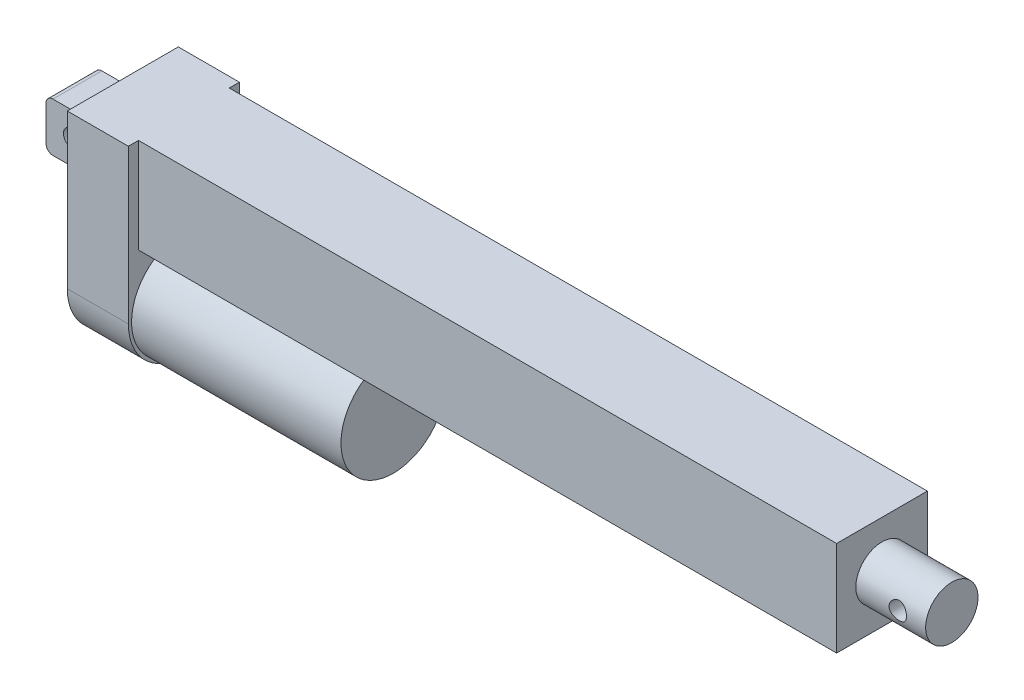
ISO-10303-21;
HEADER;
FILE_DESCRIPTION(('STEP AP214'),'2;1');
FILE_NAME('part.step','',(''),(''),'','','');
FILE_SCHEMA(('AUTOMOTIVE_DESIGN { 1 0 10303 214 1 1 1 1 }'));
ENDSEC;
DATA;
#1=APPLICATION_CONTEXT('core data for automotive mechanical design processes');
#2=APPLICATION_PROTOCOL_DEFINITION('international standard','automotive_design',2000,#1);
#3=PRODUCT_CONTEXT('',#1,'mechanical');
#4=PRODUCT('Part','Part','',(#3));
#5=PRODUCT_RELATED_PRODUCT_CATEGORY('part','',(#4));
#6=PRODUCT_DEFINITION_FORMATION('','',#4);
#7=PRODUCT_DEFINITION_CONTEXT('part definition',#1,'design');
#8=PRODUCT_DEFINITION('design','',#6,#7);
#9=PRODUCT_DEFINITION_SHAPE('','',#8);
#10=(LENGTH_UNIT() NAMED_UNIT(*) SI_UNIT(.MILLI.,.METRE.));
#11=(NAMED_UNIT(*) PLANE_ANGLE_UNIT() SI_UNIT($,.RADIAN.));
#12=(NAMED_UNIT(*) SI_UNIT($,.STERADIAN.) SOLID_ANGLE_UNIT());
#13=UNCERTAINTY_MEASURE_WITH_UNIT(LENGTH_MEASURE(1.E-05),#10,'distance_accuracy_value','');
#14=(GEOMETRIC_REPRESENTATION_CONTEXT(3) GLOBAL_UNCERTAINTY_ASSIGNED_CONTEXT((#13)) GLOBAL_UNIT_ASSIGNED_CONTEXT((#10,
#11,#12)) REPRESENTATION_CONTEXT('',''));
#15=CARTESIAN_POINT('',(0.,0.,0.));
#16=DIRECTION('',(0.,0.,1.));
#17=DIRECTION('',(1.,0.,0.));
#18=AXIS2_PLACEMENT_3D('',#15,#16,#17);
#19=CARTESIAN_POINT('',(-276.225,-38.735,0.));
#20=DIRECTION('',(-1.,0.,0.));
#21=DIRECTION('',(0.,0.,1.));
#22=AXIS2_PLACEMENT_3D('',#19,#20,#21);
#23=PLANE('',#22);
#24=DIRECTION('',(0.,1.,0.));
#25=VECTOR('',#24,1.);
#26=CARTESIAN_POINT('',(-276.225,-10.668,11.43));
#27=LINE('',#26,#25);
#28=CARTESIAN_POINT('',(-276.225,9.65199999999999,11.43));
#29=VERTEX_POINT('',#28);
#30=CARTESIAN_POINT('',(-276.225,-13.208,11.43));
#31=VERTEX_POINT('',#30);
#32=EDGE_CURVE('E395',#29,#31,#27,.F.);
#33=ORIENTED_EDGE('',*,*,#32,.T.);
#34=DIRECTION('',(0.,0.,-1.));
#35=VECTOR('',#34,1.);
#36=CARTESIAN_POINT('',(-276.225,-13.208,0.));
#37=LINE('',#36,#35);
#38=CARTESIAN_POINT('',(-276.225,-13.208,-11.43));
#39=VERTEX_POINT('',#38);
#40=EDGE_CURVE('E421',#31,#39,#37,.T.);
#41=ORIENTED_EDGE('',*,*,#40,.T.);
#42=DIRECTION('',(0.,1.,0.));
#43=VECTOR('',#42,1.);
#44=CARTESIAN_POINT('',(-276.225,-38.735,-11.43));
#45=LINE('',#44,#43);
#46=CARTESIAN_POINT('',(-276.225,9.65199999999999,-11.43));
#47=VERTEX_POINT('',#46);
#48=EDGE_CURVE('E424',#39,#47,#45,.T.);
#49=ORIENTED_EDGE('',*,*,#48,.T.);
#50=DIRECTION('',(0.,0.,-1.));
#51=VECTOR('',#50,1.);
#52=CARTESIAN_POINT('',(-276.225,9.65199999999999,0.));
#53=LINE('',#52,#51);
#54=EDGE_CURVE('E427',#47,#29,#53,.F.);
#55=ORIENTED_EDGE('',*,*,#54,.T.);
#56=EDGE_LOOP('',(#33,#41,#49,#55));
#57=FACE_BOUND('',#56,.T.);
#58=DIRECTION('',(0.,-1.,0.));
#59=VECTOR('',#58,1.);
#60=CARTESIAN_POINT('',(-276.225,17.272,-20.193));
#61=LINE('',#60,#59);
#62=CARTESIAN_POINT('',(-276.225,17.272,-20.193));
#63=VERTEX_POINT('',#62);
#64=CARTESIAN_POINT('',(-276.225,-38.735,-20.193));
#65=VERTEX_POINT('',#64);
#66=EDGE_CURVE('E165',#63,#65,#61,.T.);
#67=ORIENTED_EDGE('',*,*,#66,.T.);
#68=CARTESIAN_POINT('',(-276.225,-38.735,0.));
#69=DIRECTION('',(-1.,0.,0.));
#70=DIRECTION('',(0.,0.,1.));
#71=AXIS2_PLACEMENT_3D('',#68,#69,#70);
#72=CIRCLE('',#71,20.193);
#73=CARTESIAN_POINT('',(-276.225,-38.735,20.193));
#74=VERTEX_POINT('',#73);
#75=EDGE_CURVE('E154',#65,#74,#72,.T.);
#76=ORIENTED_EDGE('',*,*,#75,.T.);
#77=DIRECTION('',(0.,1.,0.));
#78=VECTOR('',#77,1.);
#79=CARTESIAN_POINT('',(-276.225,17.272,20.193));
#80=LINE('',#79,#78);
#81=CARTESIAN_POINT('',(-276.225,17.272,20.193));
#82=VERTEX_POINT('',#81);
#83=EDGE_CURVE('E164',#74,#82,#80,.T.);
#84=ORIENTED_EDGE('',*,*,#83,.T.);
#85=DIRECTION('',(0.,0.,-1.));
#86=VECTOR('',#85,1.);
#87=CARTESIAN_POINT('',(-276.225,17.272,-20.193));
#88=LINE('',#87,#86);
#89=EDGE_CURVE('E169',#82,#63,#88,.T.);
#90=ORIENTED_EDGE('',*,*,#89,.T.);
#91=EDGE_LOOP('',(#67,#76,#84,#90));
#92=FACE_BOUND('',#91,.T.);
#93=ADVANCED_FACE('F39',(#57,#92),#23,.T.);
#94=CARTESIAN_POINT('',(25.4,0.,0.));
#95=DIRECTION('',(-1.,0.,0.));
#96=DIRECTION('',(0.,0.,1.));
#97=AXIS2_PLACEMENT_3D('',#94,#95,#96);
#98=CYLINDRICAL_SURFACE('',#97,9.525);
#99=CARTESIAN_POINT('',(18.415,0.,-9.525));
#100=CARTESIAN_POINT('',(18.4150008055979,0.173238677165345,-9.52500048580498));
#101=CARTESIAN_POINT('',(18.4007751550461,0.346472492659894,-9.52023018186455));
#102=CARTESIAN_POINT('',(18.3444225795053,0.687837590771684,-9.50167042395416));
#103=CARTESIAN_POINT('',(18.3022927579622,0.855968341777242,-9.48788003366834));
#104=CARTESIAN_POINT('',(18.1917364022556,1.18215660666813,-9.45277852602955));
#105=CARTESIAN_POINT('',(18.1233538266918,1.34023044718815,-9.43147998545459));
#106=CARTESIAN_POINT('',(17.9624317762382,1.6426654243569,-9.3835361515256));
#107=CARTESIAN_POINT('',(17.8698875361167,1.78702384834388,-9.35688980370195));
#108=CARTESIAN_POINT('',(17.6599030695734,2.06292981819569,-9.30002249856541));
#109=CARTESIAN_POINT('',(17.5417758312229,2.19393674844712,-9.26971591772517));
#110=CARTESIAN_POINT('',(17.2854392838066,2.4346937993291,-9.20941499436411));
#111=CARTESIAN_POINT('',(17.147225564102,2.54443923892903,-9.17942072197494));
#112=CARTESIAN_POINT('',(16.8497722592512,2.74264419157344,-9.12219830615344));
#113=CARTESIAN_POINT('',(16.6900423763505,2.83040092485176,-9.0950744970031));
#114=CARTESIAN_POINT('',(16.3570409000941,2.97757492456175,-9.04796594704059));
#115=CARTESIAN_POINT('',(16.1837734580083,3.03700083920296,-9.02797902810368));
#116=CARTESIAN_POINT('',(15.8347625217479,3.12379824029158,-8.99830887880273));
#117=CARTESIAN_POINT('',(15.6592993630472,3.15218269826285,-8.98830104068516));
#118=CARTESIAN_POINT('',(15.3058375805551,3.17925806658695,-8.97876209798687));
#119=CARTESIAN_POINT('',(15.1278397572483,3.17795815259496,-8.97922775597168));
#120=CARTESIAN_POINT('',(14.7830011983402,3.14648819425834,-8.99029872650973));
#121=CARTESIAN_POINT('',(14.6160223207321,3.11764017430519,-9.00043970379418));
#122=CARTESIAN_POINT('',(14.2894258927483,3.03404956704688,-9.0289588827545));
#123=CARTESIAN_POINT('',(14.1298092262437,2.97930387942917,-9.04733807064542));
#124=CARTESIAN_POINT('',(13.8194645200471,2.84460650934115,-9.09059367841715));
#125=CARTESIAN_POINT('',(13.6689210191343,2.76426310464554,-9.11556996393148));
#126=CARTESIAN_POINT('',(13.3830348662119,2.58092291251245,-9.16916373477932));
#127=CARTESIAN_POINT('',(13.2476966219865,2.4779195817557,-9.19778227084722));
#128=CARTESIAN_POINT('',(12.9886341758396,2.24583413126609,-9.25726270107578));
#129=CARTESIAN_POINT('',(12.8658851949337,2.11567125149228,-9.28816371201626));
#130=CARTESIAN_POINT('',(12.6437032283437,1.83622813465494,-9.34742029378842));
#131=CARTESIAN_POINT('',(12.5442724788277,1.68694606622307,-9.37577562033364));
#132=CARTESIAN_POINT('',(12.3707642467537,1.37143367142189,-9.42711817702495));
#133=CARTESIAN_POINT('',(12.2969480649932,1.20504990262186,-9.45004936275525));
#134=CARTESIAN_POINT('',(12.1786549226906,0.861279339682304,-9.48755300683581));
#135=CARTESIAN_POINT('',(12.1341677705306,0.683896391141972,-9.50212836854242));
#136=CARTESIAN_POINT('',(12.077523260379,0.331418658755536,-9.52079715951823));
#137=CARTESIAN_POINT('',(12.0640481058765,0.156557979570884,-9.52531755822087));
#138=CARTESIAN_POINT('',(12.0660562386752,-0.192960847123755,-9.52464766056077));
#139=CARTESIAN_POINT('',(12.0815346379361,-0.36761902383989,-9.51945900331475));
#140=CARTESIAN_POINT('',(12.1399678070617,-0.70650057551601,-9.50023578476806));
#141=CARTESIAN_POINT('',(12.1821137042072,-0.870879661700627,-9.48646180908036));
#142=CARTESIAN_POINT('',(12.2916741861819,-1.19016766849014,-9.45171613685472));
#143=CARTESIAN_POINT('',(12.3590919933102,-1.34507537851482,-9.43074352248193));
#144=CARTESIAN_POINT('',(12.5192486210945,-1.64556534104864,-9.38304356837145));
#145=CARTESIAN_POINT('',(12.6126068336741,-1.79079512051443,-9.35617936849621));
#146=CARTESIAN_POINT('',(12.8212664262928,-2.06395583568048,-9.29974181184133));
#147=CARTESIAN_POINT('',(12.9365745079009,-2.19188146775095,-9.27016762910403));
#148=CARTESIAN_POINT('',(13.1920575344459,-2.43285171228499,-9.20993992337912));
#149=CARTESIAN_POINT('',(13.3331242954928,-2.54495607735531,-9.17929841452584));
#150=CARTESIAN_POINT('',(13.6327247277996,-2.74401763337734,-9.121774152107));
#151=CARTESIAN_POINT('',(13.7912585446632,-2.83097461468095,-9.09489142987858));
#152=CARTESIAN_POINT('',(14.1213618235454,-2.97687025407193,-9.04819093937643));
#153=CARTESIAN_POINT('',(14.2929041013608,-3.03586556962393,-9.02835890517708));
#154=CARTESIAN_POINT('',(14.6443022138901,-3.12386556696094,-8.99829392572978));
#155=CARTESIAN_POINT('',(14.8241542651588,-3.15288375947874,-8.98805665630056));
#156=CARTESIAN_POINT('',(15.1771257799299,-3.17905219686554,-8.97883201925513));
#157=CARTESIAN_POINT('',(15.3501164304107,-3.17776306695415,-8.97929370817294));
#158=CARTESIAN_POINT('',(15.6932791128776,-3.14719428169958,-8.9900528169078));
#159=CARTESIAN_POINT('',(15.8634513120074,-3.11791629228099,-9.00034965132724));
#160=CARTESIAN_POINT('',(16.1929307300329,-3.03330550668565,-9.02920864668032));
#161=CARTESIAN_POINT('',(16.3523829193893,-2.97847812359924,-9.04761011221367));
#162=CARTESIAN_POINT('',(16.659947017029,-2.84473448628718,-9.09054566248638));
#163=CARTESIAN_POINT('',(16.8080563990219,-2.76581288515832,-9.11508110823774));
#164=CARTESIAN_POINT('',(17.0957356520052,-2.58210269895237,-9.16885482792697));
#165=CARTESIAN_POINT('',(17.2346508935274,-2.47633567077753,-9.19825159463786));
#166=CARTESIAN_POINT('',(17.4932651574948,-2.24359115395567,-9.25777156199328));
#167=CARTESIAN_POINT('',(17.6129587278096,-2.11660766813344,-9.28789496596782));
#168=CARTESIAN_POINT('',(17.8344335090181,-1.83909194322317,-9.34688346918603));
#169=CARTESIAN_POINT('',(17.9353348041094,-1.68783480536163,-9.3756537721899));
#170=CARTESIAN_POINT('',(18.1101696116008,-1.36955960976602,-9.42740021973043));
#171=CARTESIAN_POINT('',(18.1841100183025,-1.2025455950702,-9.45037784507677));
#172=CARTESIAN_POINT('',(18.2998161831515,-0.865167329863089,-9.48707510342621));
#173=CARTESIAN_POINT('',(18.3428718303862,-0.695286130622591,-9.50116249441509));
#174=CARTESIAN_POINT('',(18.4004593911499,-0.350267320832532,-9.52012342428904));
#175=CARTESIAN_POINT('',(18.4149991856015,-0.175131176180768,-9.52499950888798));
#176=CARTESIAN_POINT('',(18.415,0.,-9.525));
#177=B_SPLINE_CURVE_WITH_KNOTS('',3,(#99,#100,#101,#102,#103,#104,#105,#106,#107,#108,#109,#110,
#111,#112,#113,#114,#115,#116,#117,#118,#119,#120,#121,#122,#123,#124,#125,#126,#127,#128,#129,
#130,#131,#132,#133,#134,#135,#136,#137,#138,#139,#140,#141,#142,#143,#144,#145,#146,#147,#148,
#149,#150,#151,#152,#153,#154,#155,#156,#157,#158,#159,#160,#161,#162,#163,#164,#165,#166,#167,
#168,#169,#170,#171,#172,#173,#174,#175,#176),.UNSPECIFIED.,.T.,.F.,(4,2,2,2,2,2,2,2,2,2,2,2,2,
2,2,2,2,2,2,2,2,2,2,2,2,2,2,2,2,2,2,2,2,2,2,2,2,2,4),(0.,0.519071561632582,1.03819701322437,
1.55645698636311,2.07481924951213,2.60936372597749,3.14402575687907,3.69406121814517,
4.24392866899744,4.7752611423034,5.30642937910264,5.81332424300312,6.32027980466152,
6.83539943417536,7.35066800622304,7.89283745951086,8.43505888444009,8.98265937939881,
9.53006948685132,10.0537512658116,10.5773446429626,11.0857715158082,11.5942632377702,
12.1161301950386,12.638156741095,13.1839024764638,13.7296527614611,14.2742924389999,
14.8186865394104,15.3351123975401,15.8515075194061,16.3580948898032,16.8647947620872,
17.3936046174647,17.9225642031799,18.4721392315143,19.0215736265904,19.5464607283685,
20.0712027467108),.UNSPECIFIED.);
#178=CARTESIAN_POINT('',(18.415,0.,-9.525));
#179=VERTEX_POINT('',#178);
#180=EDGE_CURVE('E227',#179,#179,#177,.T.);
#181=ORIENTED_EDGE('',*,*,#180,.T.);
#182=EDGE_LOOP('',(#181));
#183=FACE_BOUND('',#182,.T.);
#184=CARTESIAN_POINT('',(18.415,0.,9.52499999999999));
#185=CARTESIAN_POINT('',(18.4150008055979,-0.173238677165346,9.52500048580497));
#186=CARTESIAN_POINT('',(18.4007751550461,-0.346472492659895,9.52023018186455));
#187=CARTESIAN_POINT('',(18.3444225795053,-0.687837590771684,9.50167042395417));
#188=CARTESIAN_POINT('',(18.3022927579622,-0.855968341777243,9.48788003366834));
#189=CARTESIAN_POINT('',(18.1917364022556,-1.18215660666813,9.45277852602955));
#190=CARTESIAN_POINT('',(18.1233538266918,-1.34023044718815,9.43147998545459));
#191=CARTESIAN_POINT('',(17.9624317762382,-1.6426654243569,9.3835361515256));
#192=CARTESIAN_POINT('',(17.8698875361167,-1.78702384834388,9.35688980370195));
#193=CARTESIAN_POINT('',(17.6599030695734,-2.06292981819569,9.30002249856541));
#194=CARTESIAN_POINT('',(17.5417758312229,-2.19393674844712,9.26971591772517));
#195=CARTESIAN_POINT('',(17.2854392838066,-2.43469379932911,9.20941499436411));
#196=CARTESIAN_POINT('',(17.147225564102,-2.54443923892903,9.17942072197494));
#197=CARTESIAN_POINT('',(16.8497722592512,-2.74264419157344,9.12219830615344));
#198=CARTESIAN_POINT('',(16.6900423763505,-2.83040092485176,9.0950744970031));
#199=CARTESIAN_POINT('',(16.3570409000941,-2.97757492456175,9.04796594704059));
#200=CARTESIAN_POINT('',(16.1837734580083,-3.03700083920296,9.02797902810368));
#201=CARTESIAN_POINT('',(15.8347625217479,-3.12379824029158,8.99830887880273));
#202=CARTESIAN_POINT('',(15.6592993630472,-3.15218269826285,8.98830104068516));
#203=CARTESIAN_POINT('',(15.3058375805551,-3.17925806658695,8.97876209798687));
#204=CARTESIAN_POINT('',(15.1278397572483,-3.17795815259496,8.97922775597168));
#205=CARTESIAN_POINT('',(14.7830011983402,-3.14648819425834,8.99029872650973));
#206=CARTESIAN_POINT('',(14.6160223207321,-3.11764017430519,9.00043970379418));
#207=CARTESIAN_POINT('',(14.2894258927483,-3.03404956704688,9.0289588827545));
#208=CARTESIAN_POINT('',(14.1298092262437,-2.97930387942917,9.04733807064542));
#209=CARTESIAN_POINT('',(13.8194645200471,-2.84460650934115,9.09059367841715));
#210=CARTESIAN_POINT('',(13.6689210191343,-2.76426310464554,9.11556996393148));
#211=CARTESIAN_POINT('',(13.3830348662119,-2.58092291251245,9.16916373477932));
#212=CARTESIAN_POINT('',(13.2476966219865,-2.4779195817557,9.19778227084722));
#213=CARTESIAN_POINT('',(12.9886341758396,-2.24583413126609,9.25726270107578));
#214=CARTESIAN_POINT('',(12.8658851949337,-2.11567125149228,9.28816371201626));
#215=CARTESIAN_POINT('',(12.6437032283437,-1.83622813465494,9.34742029378842));
#216=CARTESIAN_POINT('',(12.5442724788277,-1.68694606622307,9.37577562033364));
#217=CARTESIAN_POINT('',(12.3707642467537,-1.37143367142189,9.42711817702495));
#218=CARTESIAN_POINT('',(12.2969480649932,-1.20504990262186,9.45004936275525));
#219=CARTESIAN_POINT('',(12.1786549226906,-0.861279339682304,9.48755300683581));
#220=CARTESIAN_POINT('',(12.1341677705306,-0.683896391141971,9.50212836854242));
#221=CARTESIAN_POINT('',(12.077523260379,-0.331418658755536,9.52079715951823));
#222=CARTESIAN_POINT('',(12.0640481058765,-0.156557979570884,9.52531755822087));
#223=CARTESIAN_POINT('',(12.0660562386752,0.192960847123755,9.52464766056077));
#224=CARTESIAN_POINT('',(12.0815346379361,0.367619023839891,9.51945900331475));
#225=CARTESIAN_POINT('',(12.1399678070617,0.706500575516011,9.50023578476806));
#226=CARTESIAN_POINT('',(12.1821137042072,0.870879661700627,9.48646180908036));
#227=CARTESIAN_POINT('',(12.2916741861819,1.19016766849014,9.45171613685472));
#228=CARTESIAN_POINT('',(12.3590919933102,1.34507537851482,9.43074352248193));
#229=CARTESIAN_POINT('',(12.5192486210945,1.64556534104864,9.38304356837145));
#230=CARTESIAN_POINT('',(12.6126068336741,1.79079512051444,9.35617936849621));
#231=CARTESIAN_POINT('',(12.8212664262928,2.06395583568048,9.29974181184133));
#232=CARTESIAN_POINT('',(12.9365745079009,2.19188146775095,9.27016762910403));
#233=CARTESIAN_POINT('',(13.1920575344459,2.43285171228499,9.20993992337912));
#234=CARTESIAN_POINT('',(13.3331242954928,2.54495607735531,9.17929841452584));
#235=CARTESIAN_POINT('',(13.6327247277996,2.74401763337734,9.121774152107));
#236=CARTESIAN_POINT('',(13.7912585446632,2.83097461468095,9.09489142987858));
#237=CARTESIAN_POINT('',(14.1213618235454,2.97687025407193,9.04819093937643));
#238=CARTESIAN_POINT('',(14.2929041013608,3.03586556962393,9.02835890517708));
#239=CARTESIAN_POINT('',(14.6443022138901,3.12386556696094,8.99829392572978));
#240=CARTESIAN_POINT('',(14.8241542651588,3.15288375947874,8.98805665630056));
#241=CARTESIAN_POINT('',(15.1771257799299,3.17905219686554,8.97883201925513));
#242=CARTESIAN_POINT('',(15.3501164304107,3.17776306695415,8.97929370817294));
#243=CARTESIAN_POINT('',(15.6932791128776,3.14719428169958,8.9900528169078));
#244=CARTESIAN_POINT('',(15.8634513120074,3.11791629228099,9.00034965132724));
#245=CARTESIAN_POINT('',(16.1929307300329,3.03330550668565,9.02920864668032));
#246=CARTESIAN_POINT('',(16.3523829193893,2.97847812359924,9.04761011221367));
#247=CARTESIAN_POINT('',(16.659947017029,2.84473448628718,9.09054566248638));
#248=CARTESIAN_POINT('',(16.8080563990219,2.76581288515832,9.11508110823774));
#249=CARTESIAN_POINT('',(17.0957356520052,2.58210269895238,9.16885482792697));
#250=CARTESIAN_POINT('',(17.2346508935274,2.47633567077753,9.19825159463785));
#251=CARTESIAN_POINT('',(17.4932651574948,2.24359115395567,9.25777156199328));
#252=CARTESIAN_POINT('',(17.6129587278096,2.11660766813344,9.28789496596782));
#253=CARTESIAN_POINT('',(17.8344335090181,1.83909194322317,9.34688346918603));
#254=CARTESIAN_POINT('',(17.9353348041094,1.68783480536163,9.3756537721899));
#255=CARTESIAN_POINT('',(18.1101696116008,1.36955960976602,9.42740021973043));
#256=CARTESIAN_POINT('',(18.1841100183025,1.2025455950702,9.45037784507677));
#257=CARTESIAN_POINT('',(18.2998161831515,0.865167329863088,9.48707510342621));
#258=CARTESIAN_POINT('',(18.3428718303862,0.695286130622589,9.5011624944151));
#259=CARTESIAN_POINT('',(18.4004593911499,0.35026732083253,9.52012342428904));
#260=CARTESIAN_POINT('',(18.4149991856015,0.175131176180767,9.52499950888797));
#261=CARTESIAN_POINT('',(18.415,0.,9.52499999999999));
#262=B_SPLINE_CURVE_WITH_KNOTS('',3,(#184,#185,#186,#187,#188,#189,#190,#191,#192,#193,#194,
#195,#196,#197,#198,#199,#200,#201,#202,#203,#204,#205,#206,#207,#208,#209,#210,#211,#212,#213,
#214,#215,#216,#217,#218,#219,#220,#221,#222,#223,#224,#225,#226,#227,#228,#229,#230,#231,#232,
#233,#234,#235,#236,#237,#238,#239,#240,#241,#242,#243,#244,#245,#246,#247,#248,#249,#250,#251,
#252,#253,#254,#255,#256,#257,#258,#259,#260,#261),.UNSPECIFIED.,.T.,.F.,(4,2,2,2,2,2,2,2,2,2,2,
2,2,2,2,2,2,2,2,2,2,2,2,2,2,2,2,2,2,2,2,2,2,2,2,2,2,2,4),(0.,0.519071561632583,1.03819701322437,
1.55645698636311,2.07481924951214,2.60936372597749,3.14402575687907,3.69406121814517,
4.24392866899744,4.7752611423034,5.30642937910264,5.81332424300312,6.32027980466153,
6.83539943417536,7.35066800622304,7.89283745951086,8.43505888444009,8.98265937939881,
9.53006948685131,10.0537512658116,10.5773446429626,11.0857715158082,11.5942632377702,
12.1161301950386,12.638156741095,13.1839024764638,13.7296527614611,14.2742924389999,
14.8186865394103,15.3351123975401,15.8515075194061,16.3580948898032,16.8647947620872,
17.3936046174647,17.9225642031799,18.4721392315143,19.0215736265904,19.5464607283685,
20.0712027467108),.UNSPECIFIED.);
#263=CARTESIAN_POINT('',(18.415,0.,9.52499999999999));
#264=VERTEX_POINT('',#263);
#265=EDGE_CURVE('E217',#264,#264,#262,.T.);
#266=ORIENTED_EDGE('',*,*,#265,.T.);
#267=EDGE_LOOP('',(#266));
#268=FACE_BOUND('',#267,.T.);
#269=CARTESIAN_POINT('',(25.4,0.,0.));
#270=DIRECTION('',(1.,0.,0.));
#271=DIRECTION('',(0.,0.,-1.));
#272=AXIS2_PLACEMENT_3D('',#269,#270,#271);
#273=CIRCLE('',#272,9.525);
#274=CARTESIAN_POINT('',(25.4,0.,-9.525));
#275=VERTEX_POINT('',#274);
#276=EDGE_CURVE('E214',#275,#275,#273,.T.);
#277=ORIENTED_EDGE('',*,*,#276,.F.);
#278=EDGE_LOOP('',(#277));
#279=FACE_BOUND('',#278,.T.);
#280=CARTESIAN_POINT('',(0.,0.,0.));
#281=DIRECTION('',(1.,0.,0.));
#282=DIRECTION('',(0.,0.,-1.));
#283=AXIS2_PLACEMENT_3D('',#280,#281,#282);
#284=CIRCLE('',#283,9.525);
#285=CARTESIAN_POINT('',(0.,0.,-9.525));
#286=VERTEX_POINT('',#285);
#287=EDGE_CURVE('E213',#286,#286,#284,.T.);
#288=ORIENTED_EDGE('',*,*,#287,.T.);
#289=EDGE_LOOP('',(#288));
#290=FACE_BOUND('',#289,.T.);
#291=ADVANCED_FACE('F232',(#183,#268,#279,#290),#98,.T.);
#292=CARTESIAN_POINT('',(25.4,0.,0.));
#293=DIRECTION('',(1.,0.,0.));
#294=DIRECTION('',(0.,0.,-1.));
#295=AXIS2_PLACEMENT_3D('',#292,#293,#294);
#296=PLANE('',#295);
#297=ORIENTED_EDGE('',*,*,#276,.T.);
#298=EDGE_LOOP('',(#297));
#299=FACE_BOUND('',#298,.T.);
#300=ADVANCED_FACE('F241',(#299),#296,.T.);
#301=CARTESIAN_POINT('',(15.24,0.,-9.525));
#302=DIRECTION('',(0.,0.,1.));
#303=DIRECTION('',(1.,0.,0.));
#304=AXIS2_PLACEMENT_3D('',#301,#302,#303);
#305=CYLINDRICAL_SURFACE('',#304,3.17499999999998);
#306=ORIENTED_EDGE('',*,*,#265,.F.);
#307=EDGE_LOOP('',(#306));
#308=FACE_BOUND('',#307,.T.);
#309=ORIENTED_EDGE('',*,*,#180,.F.);
#310=EDGE_LOOP('',(#309));
#311=FACE_BOUND('',#310,.T.);
#312=ADVANCED_FACE('F236',(#308,#311),#305,.F.);
#313=CARTESIAN_POINT('',(-254.,17.272,16.51));
#314=DIRECTION('',(0.,0.,-1.));
#315=DIRECTION('',(0.,1.,0.));
#316=AXIS2_PLACEMENT_3D('',#313,#314,#315);
#317=PLANE('',#316);
#318=DIRECTION('',(0.,1.,0.));
#319=VECTOR('',#318,1.);
#320=CARTESIAN_POINT('',(0.,17.272,16.51));
#321=LINE('',#320,#319);
#322=CARTESIAN_POINT('',(0.,-17.272,16.51));
#323=VERTEX_POINT('',#322);
#324=CARTESIAN_POINT('',(0.,17.272,16.51));
#325=VERTEX_POINT('',#324);
#326=EDGE_CURVE('E178',#323,#325,#321,.T.);
#327=ORIENTED_EDGE('',*,*,#326,.T.);
#328=DIRECTION('',(1.,0.,0.));
#329=VECTOR('',#328,1.);
#330=CARTESIAN_POINT('',(-254.,17.272,16.51));
#331=LINE('',#330,#329);
#332=CARTESIAN_POINT('',(-254.,17.272,16.51));
#333=VERTEX_POINT('',#332);
#334=EDGE_CURVE('E210',#333,#325,#331,.T.);
#335=ORIENTED_EDGE('',*,*,#334,.F.);
#336=DIRECTION('',(0.,1.,0.));
#337=VECTOR('',#336,1.);
#338=CARTESIAN_POINT('',(-254.,17.272,16.51));
#339=LINE('',#338,#337);
#340=CARTESIAN_POINT('',(-254.,-17.272,16.51));
#341=VERTEX_POINT('',#340);
#342=EDGE_CURVE('E187',#341,#333,#339,.T.);
#343=ORIENTED_EDGE('',*,*,#342,.F.);
#344=DIRECTION('',(1.,0.,0.));
#345=VECTOR('',#344,1.);
#346=CARTESIAN_POINT('',(-254.,-17.272,16.51));
#347=LINE('',#346,#345);
#348=EDGE_CURVE('E196',#341,#323,#347,.T.);
#349=ORIENTED_EDGE('',*,*,#348,.T.);
#350=EDGE_LOOP('',(#327,#335,#343,#349));
#351=FACE_BOUND('',#350,.T.);
#352=ADVANCED_FACE('F240',(#351),#317,.F.);
#353=CARTESIAN_POINT('',(-254.,17.272,-16.51));
#354=DIRECTION('',(0.,-1.,0.));
#355=DIRECTION('',(0.,0.,-1.));
#356=AXIS2_PLACEMENT_3D('',#353,#354,#355);
#357=PLANE('',#356);
#358=DIRECTION('',(0.,0.,-1.));
#359=VECTOR('',#358,1.);
#360=CARTESIAN_POINT('',(0.,17.272,-16.51));
#361=LINE('',#360,#359);
#362=CARTESIAN_POINT('',(0.,17.272,-16.51));
#363=VERTEX_POINT('',#362);
#364=EDGE_CURVE('E181',#325,#363,#361,.T.);
#365=ORIENTED_EDGE('',*,*,#364,.T.);
#366=DIRECTION('',(1.,0.,0.));
#367=VECTOR('',#366,1.);
#368=CARTESIAN_POINT('',(-254.,17.272,-16.51));
#369=LINE('',#368,#367);
#370=CARTESIAN_POINT('',(-254.,17.272,-16.51));
#371=VERTEX_POINT('',#370);
#372=EDGE_CURVE('E207',#371,#363,#369,.T.);
#373=ORIENTED_EDGE('',*,*,#372,.F.);
#374=DIRECTION('',(0.,0.,-1.));
#375=VECTOR('',#374,1.);
#376=CARTESIAN_POINT('',(-254.,17.272,-20.193));
#377=LINE('',#376,#375);
#378=CARTESIAN_POINT('',(-254.,17.272,-20.193));
#379=VERTEX_POINT('',#378);
#380=EDGE_CURVE('E306',#371,#379,#377,.T.);
#381=ORIENTED_EDGE('',*,*,#380,.T.);
#382=DIRECTION('',(1.,0.,0.));
#383=VECTOR('',#382,1.);
#384=CARTESIAN_POINT('',(-276.225,17.272,-20.193));
#385=LINE('',#384,#383);
#386=EDGE_CURVE('E312',#63,#379,#385,.T.);
#387=ORIENTED_EDGE('',*,*,#386,.F.);
#388=ORIENTED_EDGE('',*,*,#89,.F.);
#389=DIRECTION('',(1.,0.,0.));
#390=VECTOR('',#389,1.);
#391=CARTESIAN_POINT('',(-276.225,17.272,20.193));
#392=LINE('',#391,#390);
#393=CARTESIAN_POINT('',(-254.,17.272,20.193));
#394=VERTEX_POINT('',#393);
#395=EDGE_CURVE('E183',#82,#394,#392,.T.);
#396=ORIENTED_EDGE('',*,*,#395,.T.);
#397=EDGE_CURVE('E173',#394,#333,#377,.T.);
#398=ORIENTED_EDGE('',*,*,#397,.T.);
#399=ORIENTED_EDGE('',*,*,#334,.T.);
#400=EDGE_LOOP('',(#365,#373,#381,#387,#388,#396,#398,#399));
#401=FACE_BOUND('',#400,.T.);
#402=ADVANCED_FACE('F284',(#401),#357,.F.);
#403=CARTESIAN_POINT('',(-254.,17.272,-16.51));
#404=DIRECTION('',(0.,0.,1.));
#405=DIRECTION('',(0.,-1.,0.));
#406=AXIS2_PLACEMENT_3D('',#403,#404,#405);
#407=PLANE('',#406);
#408=DIRECTION('',(0.,-1.,0.));
#409=VECTOR('',#408,1.);
#410=CARTESIAN_POINT('',(0.,17.272,-16.51));
#411=LINE('',#410,#409);
#412=CARTESIAN_POINT('',(0.,-17.272,-16.51));
#413=VERTEX_POINT('',#412);
#414=EDGE_CURVE('E199',#363,#413,#411,.T.);
#415=ORIENTED_EDGE('',*,*,#414,.T.);
#416=DIRECTION('',(1.,0.,0.));
#417=VECTOR('',#416,1.);
#418=CARTESIAN_POINT('',(-254.,-17.272,-16.51));
#419=LINE('',#418,#417);
#420=CARTESIAN_POINT('',(-254.,-17.272,-16.51));
#421=VERTEX_POINT('',#420);
#422=EDGE_CURVE('E204',#421,#413,#419,.T.);
#423=ORIENTED_EDGE('',*,*,#422,.F.);
#424=DIRECTION('',(0.,-1.,0.));
#425=VECTOR('',#424,1.);
#426=CARTESIAN_POINT('',(-254.,17.272,-16.51));
#427=LINE('',#426,#425);
#428=EDGE_CURVE('E190',#371,#421,#427,.T.);
#429=ORIENTED_EDGE('',*,*,#428,.F.);
#430=ORIENTED_EDGE('',*,*,#372,.T.);
#431=EDGE_LOOP('',(#415,#423,#429,#430));
#432=FACE_BOUND('',#431,.T.);
#433=ADVANCED_FACE('F281',(#432),#407,.F.);
#434=CARTESIAN_POINT('',(-254.,-17.272,-16.51));
#435=DIRECTION('',(0.,1.,0.));
#436=DIRECTION('',(0.,0.,1.));
#437=AXIS2_PLACEMENT_3D('',#434,#435,#436);
#438=PLANE('',#437);
#439=DIRECTION('',(0.,0.,1.));
#440=VECTOR('',#439,1.);
#441=CARTESIAN_POINT('',(0.,-17.272,-16.51));
#442=LINE('',#441,#440);
#443=EDGE_CURVE('E191',#413,#323,#442,.T.);
#444=ORIENTED_EDGE('',*,*,#443,.T.);
#445=ORIENTED_EDGE('',*,*,#348,.F.);
#446=DIRECTION('',(0.,0.,1.));
#447=VECTOR('',#446,1.);
#448=CARTESIAN_POINT('',(-254.,-17.272,-16.51));
#449=LINE('',#448,#447);
#450=EDGE_CURVE('E194',#421,#341,#449,.T.);
#451=ORIENTED_EDGE('',*,*,#450,.F.);
#452=ORIENTED_EDGE('',*,*,#422,.T.);
#453=EDGE_LOOP('',(#444,#445,#451,#452));
#454=FACE_BOUND('',#453,.T.);
#455=ADVANCED_FACE('F277',(#454),#438,.F.);
#456=CARTESIAN_POINT('',(0.,0.,0.));
#457=DIRECTION('',(-1.,0.,0.));
#458=DIRECTION('',(0.,0.,1.));
#459=AXIS2_PLACEMENT_3D('',#456,#457,#458);
#460=PLANE('',#459);
#461=ORIENTED_EDGE('',*,*,#287,.F.);
#462=EDGE_LOOP('',(#461));
#463=FACE_BOUND('',#462,.T.);
#464=ORIENTED_EDGE('',*,*,#326,.F.);
#465=ORIENTED_EDGE('',*,*,#443,.F.);
#466=ORIENTED_EDGE('',*,*,#414,.F.);
#467=ORIENTED_EDGE('',*,*,#364,.F.);
#468=EDGE_LOOP('',(#464,#465,#466,#467));
#469=FACE_BOUND('',#468,.T.);
#470=ADVANCED_FACE('F265',(#463,#469),#460,.F.);
#471=CARTESIAN_POINT('',(-254.,-38.735,0.));
#472=DIRECTION('',(-1.,0.,0.));
#473=DIRECTION('',(0.,0.,1.));
#474=AXIS2_PLACEMENT_3D('',#471,#472,#473);
#475=PLANE('',#474);
#476=CARTESIAN_POINT('',(-254.,-38.735,0.));
#477=DIRECTION('',(-1.,0.,0.));
#478=DIRECTION('',(0.,0.,1.));
#479=AXIS2_PLACEMENT_3D('',#476,#477,#478);
#480=CIRCLE('',#479,19.05);
#481=CARTESIAN_POINT('',(-254.,-38.735,19.05));
#482=VERTEX_POINT('',#481);
#483=EDGE_CURVE('E428',#482,#482,#480,.F.);
#484=ORIENTED_EDGE('',*,*,#483,.F.);
#485=EDGE_LOOP('',(#484));
#486=FACE_BOUND('',#485,.T.);
#487=ORIENTED_EDGE('',*,*,#450,.T.);
#488=ORIENTED_EDGE('',*,*,#342,.T.);
#489=ORIENTED_EDGE('',*,*,#397,.F.);
#490=DIRECTION('',(0.,1.,0.));
#491=VECTOR('',#490,1.);
#492=CARTESIAN_POINT('',(-254.,17.272,20.193));
#493=LINE('',#492,#491);
#494=CARTESIAN_POINT('',(-254.,-38.735,20.193));
#495=VERTEX_POINT('',#494);
#496=EDGE_CURVE('E308',#495,#394,#493,.T.);
#497=ORIENTED_EDGE('',*,*,#496,.F.);
#498=CARTESIAN_POINT('',(-254.,-38.735,0.));
#499=DIRECTION('',(-1.,0.,0.));
#500=DIRECTION('',(0.,0.,1.));
#501=AXIS2_PLACEMENT_3D('',#498,#499,#500);
#502=CIRCLE('',#501,20.193);
#503=CARTESIAN_POINT('',(-254.,-38.735,-20.193));
#504=VERTEX_POINT('',#503);
#505=EDGE_CURVE('E316',#504,#495,#502,.T.);
#506=ORIENTED_EDGE('',*,*,#505,.F.);
#507=DIRECTION('',(0.,-1.,0.));
#508=VECTOR('',#507,1.);
#509=CARTESIAN_POINT('',(-254.,17.272,-20.193));
#510=LINE('',#509,#508);
#511=EDGE_CURVE('E177',#379,#504,#510,.T.);
#512=ORIENTED_EDGE('',*,*,#511,.F.);
#513=ORIENTED_EDGE('',*,*,#380,.F.);
#514=ORIENTED_EDGE('',*,*,#428,.T.);
#515=EDGE_LOOP('',(#487,#488,#489,#497,#506,#512,#513,#514));
#516=FACE_BOUND('',#515,.T.);
#517=ADVANCED_FACE('F262',(#486,#516),#475,.F.);
#518=CARTESIAN_POINT('',(-276.225,17.272,-20.193));
#519=DIRECTION('',(0.,0.,1.));
#520=DIRECTION('',(0.,-1.,0.));
#521=AXIS2_PLACEMENT_3D('',#518,#519,#520);
#522=PLANE('',#521);
#523=ORIENTED_EDGE('',*,*,#511,.T.);
#524=DIRECTION('',(1.,0.,0.));
#525=VECTOR('',#524,1.);
#526=CARTESIAN_POINT('',(-276.225,-38.735,-20.193));
#527=LINE('',#526,#525);
#528=EDGE_CURVE('E158',#65,#504,#527,.T.);
#529=ORIENTED_EDGE('',*,*,#528,.F.);
#530=ORIENTED_EDGE('',*,*,#66,.F.);
#531=ORIENTED_EDGE('',*,*,#386,.T.);
#532=EDGE_LOOP('',(#523,#529,#530,#531));
#533=FACE_BOUND('',#532,.T.);
#534=ADVANCED_FACE('F175',(#533),#522,.F.);
#535=CARTESIAN_POINT('',(-276.225,-38.735,0.));
#536=DIRECTION('',(1.,0.,0.));
#537=DIRECTION('',(0.,0.,-1.));
#538=AXIS2_PLACEMENT_3D('',#535,#536,#537);
#539=CYLINDRICAL_SURFACE('',#538,20.193);
#540=ORIENTED_EDGE('',*,*,#505,.T.);
#541=DIRECTION('',(1.,0.,0.));
#542=VECTOR('',#541,1.);
#543=CARTESIAN_POINT('',(-276.225,-38.735,20.193));
#544=LINE('',#543,#542);
#545=EDGE_CURVE('E161',#74,#495,#544,.T.);
#546=ORIENTED_EDGE('',*,*,#545,.F.);
#547=ORIENTED_EDGE('',*,*,#75,.F.);
#548=ORIENTED_EDGE('',*,*,#528,.T.);
#549=EDGE_LOOP('',(#540,#546,#547,#548));
#550=FACE_BOUND('',#549,.T.);
#551=ADVANCED_FACE('F156',(#550),#539,.T.);
#552=CARTESIAN_POINT('',(-276.225,17.272,20.193));
#553=DIRECTION('',(0.,0.,-1.));
#554=DIRECTION('',(0.,1.,0.));
#555=AXIS2_PLACEMENT_3D('',#552,#553,#554);
#556=PLANE('',#555);
#557=ORIENTED_EDGE('',*,*,#496,.T.);
#558=ORIENTED_EDGE('',*,*,#395,.F.);
#559=ORIENTED_EDGE('',*,*,#83,.F.);
#560=ORIENTED_EDGE('',*,*,#545,.T.);
#561=EDGE_LOOP('',(#557,#558,#559,#560));
#562=FACE_BOUND('',#561,.T.);
#563=ADVANCED_FACE('F267',(#562),#556,.F.);
#564=CARTESIAN_POINT('',(-177.8,-38.735,0.));
#565=DIRECTION('',(-1.,0.,0.));
#566=DIRECTION('',(0.,0.,1.));
#567=AXIS2_PLACEMENT_3D('',#564,#565,#566);
#568=CYLINDRICAL_SURFACE('',#567,19.05);
#569=CARTESIAN_POINT('',(-177.8,-38.735,0.));
#570=DIRECTION('',(1.,0.,0.));
#571=DIRECTION('',(0.,0.,-1.));
#572=AXIS2_PLACEMENT_3D('',#569,#570,#571);
#573=CIRCLE('',#572,19.05);
#574=CARTESIAN_POINT('',(-177.8,-38.735,19.05));
#575=VERTEX_POINT('',#574);
#576=EDGE_CURVE('E317',#575,#575,#573,.T.);
#577=CARTESIAN_POINT('',(-177.8,-38.735,19.05));
#578=CARTESIAN_POINT('',(-178.59375,-38.735,19.05));
#579=CARTESIAN_POINT('',(-179.3875,-38.735,19.05));
#580=CARTESIAN_POINT('',(-180.975,-38.735,19.05));
#581=CARTESIAN_POINT('',(-181.76875,-38.735,19.05));
#582=CARTESIAN_POINT('',(-183.35625,-38.735,19.05));
#583=CARTESIAN_POINT('',(-184.15,-38.735,19.05));
#584=CARTESIAN_POINT('',(-185.7375,-38.735,19.05));
#585=CARTESIAN_POINT('',(-186.53125,-38.735,19.05));
#586=CARTESIAN_POINT('',(-188.11875,-38.735,19.05));
#587=CARTESIAN_POINT('',(-188.9125,-38.735,19.05));
#588=CARTESIAN_POINT('',(-190.5,-38.735,19.05));
#589=CARTESIAN_POINT('',(-191.29375,-38.735,19.05));
#590=CARTESIAN_POINT('',(-192.88125,-38.735,19.05));
#591=CARTESIAN_POINT('',(-193.675,-38.735,19.05));
#592=CARTESIAN_POINT('',(-195.2625,-38.735,19.05));
#593=CARTESIAN_POINT('',(-196.05625,-38.735,19.05));
#594=CARTESIAN_POINT('',(-197.64375,-38.735,19.05));
#595=CARTESIAN_POINT('',(-198.4375,-38.735,19.05));
#596=CARTESIAN_POINT('',(-200.025,-38.735,19.05));
#597=CARTESIAN_POINT('',(-200.81875,-38.735,19.05));
#598=CARTESIAN_POINT('',(-202.40625,-38.735,19.05));
#599=CARTESIAN_POINT('',(-203.2,-38.735,19.05));
#600=CARTESIAN_POINT('',(-204.7875,-38.735,19.05));
#601=CARTESIAN_POINT('',(-205.58125,-38.735,19.05));
#602=CARTESIAN_POINT('',(-207.16875,-38.735,19.05));
#603=CARTESIAN_POINT('',(-207.9625,-38.735,19.05));
#604=CARTESIAN_POINT('',(-209.55,-38.735,19.05));
#605=CARTESIAN_POINT('',(-210.34375,-38.735,19.05));
#606=CARTESIAN_POINT('',(-211.93125,-38.735,19.05));
#607=CARTESIAN_POINT('',(-212.725,-38.735,19.05));
#608=CARTESIAN_POINT('',(-214.3125,-38.735,19.05));
#609=CARTESIAN_POINT('',(-215.10625,-38.735,19.05));
#610=CARTESIAN_POINT('',(-216.69375,-38.735,19.05));
#611=CARTESIAN_POINT('',(-217.4875,-38.735,19.05));
#612=CARTESIAN_POINT('',(-219.075,-38.735,19.05));
#613=CARTESIAN_POINT('',(-219.86875,-38.735,19.05));
#614=CARTESIAN_POINT('',(-221.45625,-38.735,19.05));
#615=CARTESIAN_POINT('',(-222.25,-38.735,19.05));
#616=CARTESIAN_POINT('',(-223.8375,-38.735,19.05));
#617=CARTESIAN_POINT('',(-224.63125,-38.735,19.05));
#618=CARTESIAN_POINT('',(-226.21875,-38.735,19.05));
#619=CARTESIAN_POINT('',(-227.0125,-38.735,19.05));
#620=CARTESIAN_POINT('',(-228.6,-38.735,19.05));
#621=CARTESIAN_POINT('',(-229.39375,-38.735,19.05));
#622=CARTESIAN_POINT('',(-230.98125,-38.735,19.05));
#623=CARTESIAN_POINT('',(-231.775,-38.735,19.05));
#624=CARTESIAN_POINT('',(-233.3625,-38.735,19.05));
#625=CARTESIAN_POINT('',(-234.15625,-38.735,19.05));
#626=CARTESIAN_POINT('',(-235.74375,-38.735,19.05));
#627=CARTESIAN_POINT('',(-236.5375,-38.735,19.05));
#628=CARTESIAN_POINT('',(-238.125,-38.735,19.05));
#629=CARTESIAN_POINT('',(-238.91875,-38.735,19.05));
#630=CARTESIAN_POINT('',(-240.50625,-38.735,19.05));
#631=CARTESIAN_POINT('',(-241.3,-38.735,19.05));
#632=CARTESIAN_POINT('',(-242.8875,-38.735,19.05));
#633=CARTESIAN_POINT('',(-243.68125,-38.735,19.05));
#634=CARTESIAN_POINT('',(-245.26875,-38.735,19.05));
#635=CARTESIAN_POINT('',(-246.0625,-38.735,19.05));
#636=CARTESIAN_POINT('',(-247.65,-38.735,19.05));
#637=CARTESIAN_POINT('',(-248.44375,-38.735,19.05));
#638=CARTESIAN_POINT('',(-250.03125,-38.735,19.05));
#639=CARTESIAN_POINT('',(-250.825,-38.735,19.05));
#640=CARTESIAN_POINT('',(-252.4125,-38.735,19.05));
#641=CARTESIAN_POINT('',(-253.20625,-38.735,19.05));
#642=CARTESIAN_POINT('',(-254.,-38.735,19.05));
#643=B_SPLINE_CURVE_WITH_KNOTS('',3,(#577,#578,#579,#580,#581,#582,#583,#584,#585,#586,#587,
#588,#589,#590,#591,#592,#593,#594,#595,#596,#597,#598,#599,#600,#601,#602,#603,#604,#605,#606,
#607,#608,#609,#610,#611,#612,#613,#614,#615,#616,#617,#618,#619,#620,#621,#622,#623,#624,#625,
#626,#627,#628,#629,#630,#631,#632,#633,#634,#635,#636,#637,#638,#639,#640,#641,#642),
.UNSPECIFIED.,.F.,.F.,(4,2,2,2,2,2,2,2,2,2,2,2,2,2,2,2,2,2,2,2,2,2,2,2,2,2,2,2,2,2,2,2,4),(0.,
2.38124999999997,4.76249999999998,7.14374999999998,9.52499999999998,11.90625,14.2875,16.66875,
19.05,21.43125,23.8125,26.19375,28.575,30.95625,33.3375,35.7187499999999,38.0999999999999,
40.4812499999999,42.8624999999999,45.2437499999999,47.6249999999999,50.0062499999999,
52.3874999999999,54.7687499999999,57.1499999999999,59.53125,61.9125,64.2937499999999,
66.6749999999999,69.0562499999999,71.4374999999999,73.8187499999999,76.1999999999999),.UNSPECIFIED.);
#644=EDGE_CURVE('BSEAM260',#575,#482,#643,.T.);
#645=ORIENTED_EDGE('',*,*,#576,.F.);
#646=ORIENTED_EDGE('',*,*,#483,.T.);
#647=ORIENTED_EDGE('',*,*,#644,.T.);
#648=ORIENTED_EDGE('',*,*,#644,.F.);
#649=EDGE_LOOP('',(#645,#647,#646,#648));
#650=FACE_BOUND('',#649,.T.);
#651=ADVANCED_FACE('F260',(#650),#568,.T.);
#652=CARTESIAN_POINT('',(-177.8,-38.735,0.));
#653=DIRECTION('',(1.,0.,0.));
#654=DIRECTION('',(0.,0.,-1.));
#655=AXIS2_PLACEMENT_3D('',#652,#653,#654);
#656=PLANE('',#655);
#657=ORIENTED_EDGE('',*,*,#576,.T.);
#658=EDGE_LOOP('',(#657));
#659=FACE_BOUND('',#658,.T.);
#660=ADVANCED_FACE('F350',(#659),#656,.T.);
#661=CARTESIAN_POINT('',(0.,0.,8.89));
#662=DIRECTION('',(0.,0.,1.));
#663=DIRECTION('',(1.,0.,0.));
#664=AXIS2_PLACEMENT_3D('',#661,#662,#663);
#665=PLANE('',#664);
#666=DIRECTION('',(1.,0.,0.));
#667=VECTOR('',#666,1.);
#668=CARTESIAN_POINT('',(-276.225,-10.668,8.89));
#669=LINE('',#668,#667);
#670=CARTESIAN_POINT('',(-292.735,-10.668,8.89));
#671=VERTEX_POINT('',#670);
#672=CARTESIAN_POINT('',(-278.765,-10.668,8.89));
#673=VERTEX_POINT('',#672);
#674=EDGE_CURVE('E319',#671,#673,#669,.T.);
#675=ORIENTED_EDGE('',*,*,#674,.T.);
#676=DIRECTION('',(0.,1.,0.));
#677=VECTOR('',#676,1.);
#678=CARTESIAN_POINT('',(-278.765,7.11199999999999,8.89));
#679=LINE('',#678,#677);
#680=CARTESIAN_POINT('',(-278.765,7.11199999999999,8.89));
#681=VERTEX_POINT('',#680);
#682=EDGE_CURVE('E393',#673,#681,#679,.T.);
#683=ORIENTED_EDGE('',*,*,#682,.T.);
#684=DIRECTION('',(-1.,0.,0.));
#685=VECTOR('',#684,1.);
#686=CARTESIAN_POINT('',(-276.225,7.11199999999999,8.89));
#687=LINE('',#686,#685);
#688=CARTESIAN_POINT('',(-292.735,7.11199999999999,8.89));
#689=VERTEX_POINT('',#688);
#690=EDGE_CURVE('E330',#681,#689,#687,.T.);
#691=ORIENTED_EDGE('',*,*,#690,.T.);
#692=CARTESIAN_POINT('',(-292.735,4.57199999999999,8.89));
#693=DIRECTION('',(0.,0.,1.));
#694=DIRECTION('',(1.,0.,0.));
#695=AXIS2_PLACEMENT_3D('',#692,#693,#694);
#696=CIRCLE('',#695,2.54);
#697=CARTESIAN_POINT('',(-295.275,4.57199999999999,8.89));
#698=VERTEX_POINT('',#697);
#699=EDGE_CURVE('E61',#689,#698,#696,.T.);
#700=ORIENTED_EDGE('',*,*,#699,.T.);
#701=DIRECTION('',(0.,-1.,0.));
#702=VECTOR('',#701,1.);
#703=CARTESIAN_POINT('',(-295.275,-10.668,8.89));
#704=LINE('',#703,#702);
#705=CARTESIAN_POINT('',(-295.275,-8.128,8.89));
#706=VERTEX_POINT('',#705);
#707=EDGE_CURVE('E324',#698,#706,#704,.T.);
#708=ORIENTED_EDGE('',*,*,#707,.T.);
#709=CARTESIAN_POINT('',(-292.735,-8.128,8.89));
#710=DIRECTION('',(0.,0.,1.));
#711=DIRECTION('',(1.,0.,0.));
#712=AXIS2_PLACEMENT_3D('',#709,#710,#711);
#713=CIRCLE('',#712,2.54);
#714=EDGE_CURVE('E407',#706,#671,#713,.T.);
#715=ORIENTED_EDGE('',*,*,#714,.T.);
#716=EDGE_LOOP('',(#675,#683,#691,#700,#708,#715));
#717=FACE_BOUND('',#716,.T.);
#718=CARTESIAN_POINT('',(-285.75,-1.77800000000001,8.89));
#719=DIRECTION('',(0.,0.,1.));
#720=DIRECTION('',(1.,0.,0.));
#721=AXIS2_PLACEMENT_3D('',#718,#719,#720);
#722=CIRCLE('',#721,3.17499999999997);
#723=CARTESIAN_POINT('',(-282.575,-1.77800000000001,8.89));
#724=VERTEX_POINT('',#723);
#725=EDGE_CURVE('E335',#724,#724,#722,.T.);
#726=ORIENTED_EDGE('',*,*,#725,.F.);
#727=EDGE_LOOP('',(#726));
#728=FACE_BOUND('',#727,.T.);
#729=ADVANCED_FACE('F348',(#717,#728),#665,.T.);
#730=CARTESIAN_POINT('',(0.,0.,-8.89));
#731=DIRECTION('',(0.,0.,1.));
#732=DIRECTION('',(1.,0.,0.));
#733=AXIS2_PLACEMENT_3D('',#730,#731,#732);
#734=PLANE('',#733);
#735=DIRECTION('',(-1.,0.,0.));
#736=VECTOR('',#735,1.);
#737=CARTESIAN_POINT('',(-276.225,7.11199999999999,-8.89));
#738=LINE('',#737,#736);
#739=CARTESIAN_POINT('',(-278.765,7.11199999999999,-8.89));
#740=VERTEX_POINT('',#739);
#741=CARTESIAN_POINT('',(-292.735,7.11199999999999,-8.89));
#742=VERTEX_POINT('',#741);
#743=EDGE_CURVE('E333',#740,#742,#738,.T.);
#744=ORIENTED_EDGE('',*,*,#743,.F.);
#745=DIRECTION('',(0.,1.,0.));
#746=VECTOR('',#745,1.);
#747=CARTESIAN_POINT('',(-278.765,0.,-8.89));
#748=LINE('',#747,#746);
#749=CARTESIAN_POINT('',(-278.765,-10.668,-8.89));
#750=VERTEX_POINT('',#749);
#751=EDGE_CURVE('E410',#740,#750,#748,.F.);
#752=ORIENTED_EDGE('',*,*,#751,.T.);
#753=DIRECTION('',(1.,0.,0.));
#754=VECTOR('',#753,1.);
#755=CARTESIAN_POINT('',(-276.225,-10.668,-8.89));
#756=LINE('',#755,#754);
#757=CARTESIAN_POINT('',(-292.735,-10.668,-8.89));
#758=VERTEX_POINT('',#757);
#759=EDGE_CURVE('E327',#758,#750,#756,.T.);
#760=ORIENTED_EDGE('',*,*,#759,.F.);
#761=CARTESIAN_POINT('',(-292.735,-8.128,-8.89));
#762=DIRECTION('',(0.,0.,1.));
#763=DIRECTION('',(1.,0.,0.));
#764=AXIS2_PLACEMENT_3D('',#761,#762,#763);
#765=CIRCLE('',#764,2.54);
#766=CARTESIAN_POINT('',(-295.275,-8.128,-8.89));
#767=VERTEX_POINT('',#766);
#768=EDGE_CURVE('E412',#758,#767,#765,.F.);
#769=ORIENTED_EDGE('',*,*,#768,.T.);
#770=DIRECTION('',(0.,-1.,0.));
#771=VECTOR('',#770,1.);
#772=CARTESIAN_POINT('',(-295.275,-10.668,-8.89));
#773=LINE('',#772,#771);
#774=CARTESIAN_POINT('',(-295.275,4.57199999999999,-8.89));
#775=VERTEX_POINT('',#774);
#776=EDGE_CURVE('E331',#775,#767,#773,.T.);
#777=ORIENTED_EDGE('',*,*,#776,.F.);
#778=CARTESIAN_POINT('',(-292.735,4.57199999999999,-8.89));
#779=DIRECTION('',(0.,0.,1.));
#780=DIRECTION('',(1.,0.,0.));
#781=AXIS2_PLACEMENT_3D('',#778,#779,#780);
#782=CIRCLE('',#781,2.54);
#783=EDGE_CURVE('E414',#775,#742,#782,.F.);
#784=ORIENTED_EDGE('',*,*,#783,.T.);
#785=EDGE_LOOP('',(#744,#752,#760,#769,#777,#784));
#786=FACE_BOUND('',#785,.T.);
#787=CARTESIAN_POINT('',(-285.75,-1.77800000000001,-8.89));
#788=DIRECTION('',(0.,0.,1.));
#789=DIRECTION('',(1.,0.,0.));
#790=AXIS2_PLACEMENT_3D('',#787,#788,#789);
#791=CIRCLE('',#790,3.17499999999997);
#792=CARTESIAN_POINT('',(-282.575,-1.77800000000001,-8.89));
#793=VERTEX_POINT('',#792);
#794=EDGE_CURVE('E339',#793,#793,#791,.T.);
#795=ORIENTED_EDGE('',*,*,#794,.T.);
#796=EDGE_LOOP('',(#795));
#797=FACE_BOUND('',#796,.T.);
#798=ADVANCED_FACE('F349',(#786,#797),#734,.F.);
#799=CARTESIAN_POINT('',(-276.225,7.11199999999999,8.89));
#800=DIRECTION('',(0.,-1.,0.));
#801=DIRECTION('',(1.,0.,0.));
#802=AXIS2_PLACEMENT_3D('',#799,#800,#801);
#803=PLANE('',#802);
#804=ORIENTED_EDGE('',*,*,#690,.F.);
#805=DIRECTION('',(0.,0.,-1.));
#806=VECTOR('',#805,1.);
#807=CARTESIAN_POINT('',(-278.765,7.11199999999999,8.89));
#808=LINE('',#807,#806);
#809=EDGE_CURVE('E374',#681,#740,#808,.T.);
#810=ORIENTED_EDGE('',*,*,#809,.T.);
#811=ORIENTED_EDGE('',*,*,#743,.T.);
#812=DIRECTION('',(0.,0.,-1.));
#813=VECTOR('',#812,1.);
#814=CARTESIAN_POINT('',(-292.735,7.11199999999999,8.89));
#815=LINE('',#814,#813);
#816=EDGE_CURVE('E377',#742,#689,#815,.F.);
#817=ORIENTED_EDGE('',*,*,#816,.T.);
#818=EDGE_LOOP('',(#804,#810,#811,#817));
#819=FACE_BOUND('',#818,.T.);
#820=ADVANCED_FACE('F355',(#819),#803,.F.);
#821=CARTESIAN_POINT('',(-295.275,-10.668,8.89));
#822=DIRECTION('',(1.,0.,0.));
#823=DIRECTION('',(0.,0.,-1.));
#824=AXIS2_PLACEMENT_3D('',#821,#822,#823);
#825=PLANE('',#824);
#826=ORIENTED_EDGE('',*,*,#776,.T.);
#827=DIRECTION('',(0.,0.,-1.));
#828=VECTOR('',#827,1.);
#829=CARTESIAN_POINT('',(-295.275,-8.128,8.89));
#830=LINE('',#829,#828);
#831=EDGE_CURVE('E11',#767,#706,#830,.F.);
#832=ORIENTED_EDGE('',*,*,#831,.T.);
#833=ORIENTED_EDGE('',*,*,#707,.F.);
#834=DIRECTION('',(0.,0.,-1.));
#835=VECTOR('',#834,1.);
#836=CARTESIAN_POINT('',(-295.275,4.57199999999999,8.89));
#837=LINE('',#836,#835);
#838=EDGE_CURVE('E48',#698,#775,#837,.T.);
#839=ORIENTED_EDGE('',*,*,#838,.T.);
#840=EDGE_LOOP('',(#826,#832,#833,#839));
#841=FACE_BOUND('',#840,.T.);
#842=ADVANCED_FACE('F364',(#841),#825,.F.);
#843=CARTESIAN_POINT('',(-276.225,-10.668,8.89));
#844=DIRECTION('',(0.,1.,0.));
#845=DIRECTION('',(-1.,0.,0.));
#846=AXIS2_PLACEMENT_3D('',#843,#844,#845);
#847=PLANE('',#846);
#848=ORIENTED_EDGE('',*,*,#759,.T.);
#849=DIRECTION('',(0.,0.,-1.));
#850=VECTOR('',#849,1.);
#851=CARTESIAN_POINT('',(-278.765,-10.668,8.89));
#852=LINE('',#851,#850);
#853=EDGE_CURVE('E416',#750,#673,#852,.F.);
#854=ORIENTED_EDGE('',*,*,#853,.T.);
#855=ORIENTED_EDGE('',*,*,#674,.F.);
#856=DIRECTION('',(0.,0.,-1.));
#857=VECTOR('',#856,1.);
#858=CARTESIAN_POINT('',(-292.735,-10.668,8.89));
#859=LINE('',#858,#857);
#860=EDGE_CURVE('E418',#671,#758,#859,.T.);
#861=ORIENTED_EDGE('',*,*,#860,.T.);
#862=EDGE_LOOP('',(#848,#854,#855,#861));
#863=FACE_BOUND('',#862,.T.);
#864=ADVANCED_FACE('F361',(#863),#847,.F.);
#865=CARTESIAN_POINT('',(-285.75,-1.77800000000001,8.89));
#866=DIRECTION('',(0.,0.,-1.));
#867=DIRECTION('',(-1.,0.,0.));
#868=AXIS2_PLACEMENT_3D('',#865,#866,#867);
#869=CYLINDRICAL_SURFACE('',#868,3.17499999999997);
#870=ORIENTED_EDGE('',*,*,#725,.T.);
#871=EDGE_LOOP('',(#870));
#872=FACE_BOUND('',#871,.T.);
#873=ORIENTED_EDGE('',*,*,#794,.F.);
#874=EDGE_LOOP('',(#873));
#875=FACE_BOUND('',#874,.T.);
#876=ADVANCED_FACE('F345',(#872,#875),#869,.F.);
#877=CARTESIAN_POINT('',(-278.765,9.65199999999999,8.89));
#878=DIRECTION('',(0.,0.,-1.));
#879=DIRECTION('',(-1.,0.,0.));
#880=AXIS2_PLACEMENT_3D('',#877,#878,#879);
#881=CYLINDRICAL_SURFACE('',#880,2.54);
#882=CARTESIAN_POINT('',(-278.765,9.65199999999999,-11.43));
#883=DIRECTION('',(0.,-0.707106781186547,-0.707106781186547));
#884=DIRECTION('',(0.,0.707106781186547,-0.707106781186547));
#885=AXIS2_PLACEMENT_3D('',#882,#883,#884);
#886=ELLIPSE('',#885,3.59210244842766,2.54);
#887=EDGE_CURVE('E386',#740,#47,#886,.F.);
#888=ORIENTED_EDGE('',*,*,#887,.F.);
#889=ORIENTED_EDGE('',*,*,#809,.F.);
#890=CARTESIAN_POINT('',(-278.765,9.65199999999999,11.43));
#891=DIRECTION('',(0.,0.707106781186547,-0.707106781186547));
#892=DIRECTION('',(0.,-0.707106781186547,-0.707106781186547));
#893=AXIS2_PLACEMENT_3D('',#890,#891,#892);
#894=ELLIPSE('',#893,3.59210244842766,2.54);
#895=EDGE_CURVE('E43',#29,#681,#894,.T.);
#896=ORIENTED_EDGE('',*,*,#895,.F.);
#897=ORIENTED_EDGE('',*,*,#54,.F.);
#898=EDGE_LOOP('',(#888,#889,#896,#897));
#899=FACE_BOUND('',#898,.T.);
#900=ADVANCED_FACE('F382',(#899),#881,.F.);
#901=CARTESIAN_POINT('',(-278.765,0.,11.43));
#902=DIRECTION('',(0.,-1.,0.));
#903=DIRECTION('',(0.,0.,-1.));
#904=AXIS2_PLACEMENT_3D('',#901,#902,#903);
#905=CYLINDRICAL_SURFACE('',#904,2.54);
#906=ORIENTED_EDGE('',*,*,#895,.T.);
#907=ORIENTED_EDGE('',*,*,#682,.F.);
#908=CARTESIAN_POINT('',(-278.765,-13.208,11.43));
#909=DIRECTION('',(0.,-0.707106781186547,-0.707106781186547));
#910=DIRECTION('',(0.,-0.707106781186547,0.707106781186547));
#911=AXIS2_PLACEMENT_3D('',#908,#909,#910);
#912=ELLIPSE('',#911,3.59210244842766,2.54);
#913=EDGE_CURVE('E396',#31,#673,#912,.F.);
#914=ORIENTED_EDGE('',*,*,#913,.F.);
#915=ORIENTED_EDGE('',*,*,#32,.F.);
#916=EDGE_LOOP('',(#906,#907,#914,#915));
#917=FACE_BOUND('',#916,.T.);
#918=ADVANCED_FACE('F391',(#917),#905,.F.);
#919=CARTESIAN_POINT('',(-278.765,-38.735,-11.43));
#920=DIRECTION('',(0.,1.,0.));
#921=DIRECTION('',(0.,0.,1.));
#922=AXIS2_PLACEMENT_3D('',#919,#920,#921);
#923=CYLINDRICAL_SURFACE('',#922,2.54);
#924=ORIENTED_EDGE('',*,*,#887,.T.);
#925=ORIENTED_EDGE('',*,*,#48,.F.);
#926=CARTESIAN_POINT('',(-278.765,-13.208,-11.43));
#927=DIRECTION('',(0.,0.707106781186547,-0.707106781186547));
#928=DIRECTION('',(0.,0.707106781186547,0.707106781186547));
#929=AXIS2_PLACEMENT_3D('',#926,#927,#928);
#930=ELLIPSE('',#929,3.59210244842766,2.54);
#931=EDGE_CURVE('E399',#750,#39,#930,.T.);
#932=ORIENTED_EDGE('',*,*,#931,.F.);
#933=ORIENTED_EDGE('',*,*,#751,.F.);
#934=EDGE_LOOP('',(#924,#925,#932,#933));
#935=FACE_BOUND('',#934,.T.);
#936=ADVANCED_FACE('F482',(#935),#923,.F.);
#937=CARTESIAN_POINT('',(-278.765,-13.208,0.));
#938=DIRECTION('',(0.,0.,-1.));
#939=DIRECTION('',(-1.,0.,0.));
#940=AXIS2_PLACEMENT_3D('',#937,#938,#939);
#941=CYLINDRICAL_SURFACE('',#940,2.54);
#942=ORIENTED_EDGE('',*,*,#913,.T.);
#943=ORIENTED_EDGE('',*,*,#853,.F.);
#944=ORIENTED_EDGE('',*,*,#931,.T.);
#945=ORIENTED_EDGE('',*,*,#40,.F.);
#946=EDGE_LOOP('',(#942,#943,#944,#945));
#947=FACE_BOUND('',#946,.T.);
#948=ADVANCED_FACE('F491',(#947),#941,.F.);
#949=CARTESIAN_POINT('',(-292.735,-8.128,8.89));
#950=DIRECTION('',(0.,0.,-1.));
#951=DIRECTION('',(-1.,0.,0.));
#952=AXIS2_PLACEMENT_3D('',#949,#950,#951);
#953=CYLINDRICAL_SURFACE('',#952,2.54);
#954=ORIENTED_EDGE('',*,*,#714,.F.);
#955=ORIENTED_EDGE('',*,*,#831,.F.);
#956=ORIENTED_EDGE('',*,*,#768,.F.);
#957=ORIENTED_EDGE('',*,*,#860,.F.);
#958=EDGE_LOOP('',(#954,#955,#956,#957));
#959=FACE_BOUND('',#958,.T.);
#960=ADVANCED_FACE('F500',(#959),#953,.T.);
#961=CARTESIAN_POINT('',(-292.735,4.57199999999999,8.89));
#962=DIRECTION('',(0.,0.,-1.));
#963=DIRECTION('',(-1.,0.,0.));
#964=AXIS2_PLACEMENT_3D('',#961,#962,#963);
#965=CYLINDRICAL_SURFACE('',#964,2.54);
#966=ORIENTED_EDGE('',*,*,#699,.F.);
#967=ORIENTED_EDGE('',*,*,#816,.F.);
#968=ORIENTED_EDGE('',*,*,#783,.F.);
#969=ORIENTED_EDGE('',*,*,#838,.F.);
#970=EDGE_LOOP('',(#966,#967,#968,#969));
#971=FACE_BOUND('',#970,.T.);
#972=ADVANCED_FACE('F41',(#971),#965,.T.);
#973=CLOSED_SHELL('',(#93,#291,#300,#312,#352,#402,#433,#455,#470,#517,#534,#551,#563,#651,#660,
#729,#798,#820,#842,#864,#876,#900,#918,#936,#948,#960,#972));
#974=MANIFOLD_SOLID_BREP('B2',#973);
#975=ADVANCED_BREP_SHAPE_REPRESENTATION('',(#18,#974),#14);
#976=SHAPE_DEFINITION_REPRESENTATION(#9,#975);
ENDSEC;
END-ISO-10303-21;
